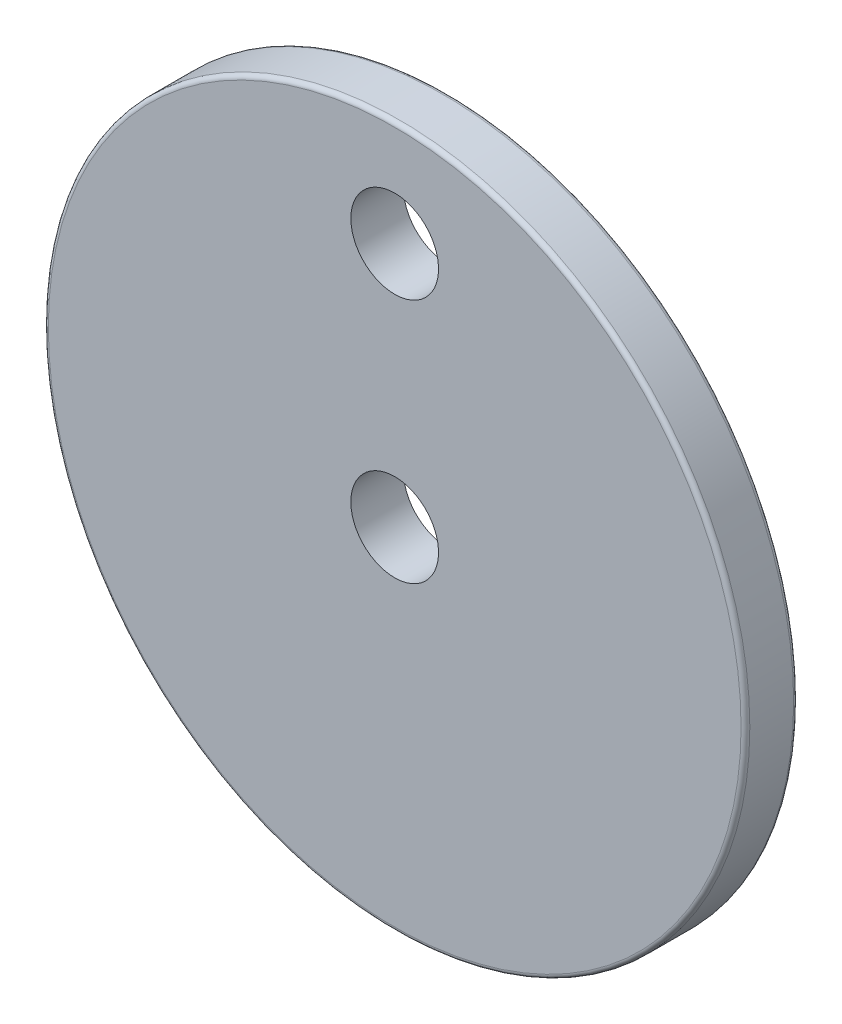
ISO-10303-21;
HEADER;
FILE_DESCRIPTION(('STEP AP214'),'2;1');
FILE_NAME('part.step','',(''),(''),'','','');
FILE_SCHEMA(('AUTOMOTIVE_DESIGN { 1 0 10303 214 1 1 1 1 }'));
ENDSEC;
DATA;
#1=APPLICATION_CONTEXT('core data for automotive mechanical design processes');
#2=APPLICATION_PROTOCOL_DEFINITION('international standard','automotive_design',2000,#1);
#3=PRODUCT_CONTEXT('',#1,'mechanical');
#4=PRODUCT('Part','Part','',(#3));
#5=PRODUCT_RELATED_PRODUCT_CATEGORY('part','',(#4));
#6=PRODUCT_DEFINITION_FORMATION('','',#4);
#7=PRODUCT_DEFINITION_CONTEXT('part definition',#1,'design');
#8=PRODUCT_DEFINITION('design','',#6,#7);
#9=PRODUCT_DEFINITION_SHAPE('','',#8);
#10=(LENGTH_UNIT() NAMED_UNIT(*) SI_UNIT(.MILLI.,.METRE.));
#11=(NAMED_UNIT(*) PLANE_ANGLE_UNIT() SI_UNIT($,.RADIAN.));
#12=(NAMED_UNIT(*) SI_UNIT($,.STERADIAN.) SOLID_ANGLE_UNIT());
#13=UNCERTAINTY_MEASURE_WITH_UNIT(LENGTH_MEASURE(1.E-05),#10,'distance_accuracy_value','');
#14=(GEOMETRIC_REPRESENTATION_CONTEXT(3) GLOBAL_UNCERTAINTY_ASSIGNED_CONTEXT((#13)) GLOBAL_UNIT_ASSIGNED_CONTEXT((#10,
#11,#12)) REPRESENTATION_CONTEXT('',''));
#15=CARTESIAN_POINT('',(0.,0.,0.));
#16=DIRECTION('',(0.,0.,1.));
#17=DIRECTION('',(1.,0.,0.));
#18=AXIS2_PLACEMENT_3D('',#15,#16,#17);
#19=CARTESIAN_POINT('',(0.,0.,38.1));
#20=DIRECTION('',(0.,0.,1.));
#21=DIRECTION('',(1.,0.,0.));
#22=AXIS2_PLACEMENT_3D('',#19,#20,#21);
#23=PLANE('',#22);
#24=CARTESIAN_POINT('',(0.,0.,38.1));
#25=DIRECTION('',(0.,0.,1.));
#26=DIRECTION('',(1.,0.,0.));
#27=AXIS2_PLACEMENT_3D('',#24,#25,#26);
#28=CIRCLE('',#27,501.65);
#29=CARTESIAN_POINT('',(501.65,0.,38.1));
#30=VERTEX_POINT('',#29);
#31=EDGE_CURVE('E10',#30,#30,#28,.T.);
#32=ORIENTED_EDGE('',*,*,#31,.T.);
#33=EDGE_LOOP('',(#32));
#34=FACE_BOUND('',#33,.T.);
#35=CARTESIAN_POINT('',(0.,0.,38.1));
#36=DIRECTION('',(0.,0.,1.));
#37=DIRECTION('',(1.,0.,0.));
#38=AXIS2_PLACEMENT_3D('',#35,#36,#37);
#39=CIRCLE('',#38,63.5);
#40=CARTESIAN_POINT('',(-63.5,0.,38.1));
#41=VERTEX_POINT('',#40);
#42=EDGE_CURVE('E50',#41,#41,#39,.T.);
#43=ORIENTED_EDGE('',*,*,#42,.F.);
#44=EDGE_LOOP('',(#43));
#45=FACE_BOUND('',#44,.T.);
#46=CARTESIAN_POINT('',(0.,355.6,38.1));
#47=DIRECTION('',(0.,0.,1.));
#48=DIRECTION('',(1.,0.,0.));
#49=AXIS2_PLACEMENT_3D('',#46,#47,#48);
#50=CIRCLE('',#49,63.5);
#51=CARTESIAN_POINT('',(-63.5,355.6,38.1));
#52=VERTEX_POINT('',#51);
#53=EDGE_CURVE('E54',#52,#52,#50,.T.);
#54=ORIENTED_EDGE('',*,*,#53,.F.);
#55=EDGE_LOOP('',(#54));
#56=FACE_BOUND('',#55,.T.);
#57=ADVANCED_FACE('F30',(#34,#45,#56),#23,.T.);
#58=CARTESIAN_POINT('',(0.,0.,-38.1));
#59=DIRECTION('',(0.,0.,1.));
#60=DIRECTION('',(1.,0.,0.));
#61=AXIS2_PLACEMENT_3D('',#58,#59,#60);
#62=PLANE('',#61);
#63=CARTESIAN_POINT('',(0.,0.,-38.1));
#64=DIRECTION('',(0.,0.,1.));
#65=DIRECTION('',(1.,0.,0.));
#66=AXIS2_PLACEMENT_3D('',#63,#64,#65);
#67=CIRCLE('',#66,501.65);
#68=CARTESIAN_POINT('',(501.65,0.,-38.1));
#69=VERTEX_POINT('',#68);
#70=EDGE_CURVE('E37',#69,#69,#67,.F.);
#71=ORIENTED_EDGE('',*,*,#70,.T.);
#72=EDGE_LOOP('',(#71));
#73=FACE_BOUND('',#72,.T.);
#74=CARTESIAN_POINT('',(0.,0.,-38.1));
#75=DIRECTION('',(0.,0.,1.));
#76=DIRECTION('',(1.,0.,0.));
#77=AXIS2_PLACEMENT_3D('',#74,#75,#76);
#78=CIRCLE('',#77,63.5);
#79=CARTESIAN_POINT('',(-63.5,0.,-38.1));
#80=VERTEX_POINT('',#79);
#81=EDGE_CURVE('E51',#80,#80,#78,.T.);
#82=ORIENTED_EDGE('',*,*,#81,.T.);
#83=EDGE_LOOP('',(#82));
#84=FACE_BOUND('',#83,.T.);
#85=CARTESIAN_POINT('',(0.,355.6,-38.1));
#86=DIRECTION('',(0.,0.,1.));
#87=DIRECTION('',(1.,0.,0.));
#88=AXIS2_PLACEMENT_3D('',#85,#86,#87);
#89=CIRCLE('',#88,63.5);
#90=CARTESIAN_POINT('',(-63.5,355.6,-38.1));
#91=VERTEX_POINT('',#90);
#92=EDGE_CURVE('E57',#91,#91,#89,.T.);
#93=ORIENTED_EDGE('',*,*,#92,.T.);
#94=EDGE_LOOP('',(#93));
#95=FACE_BOUND('',#94,.T.);
#96=ADVANCED_FACE('F67',(#73,#84,#95),#62,.F.);
#97=CARTESIAN_POINT('',(0.,0.,38.1));
#98=DIRECTION('',(0.,0.,-1.));
#99=DIRECTION('',(-1.,0.,0.));
#100=AXIS2_PLACEMENT_3D('',#97,#98,#99);
#101=CYLINDRICAL_SURFACE('',#100,508.);
#102=CARTESIAN_POINT('',(0.,0.,-31.75));
#103=DIRECTION('',(0.,0.,1.));
#104=DIRECTION('',(1.,0.,0.));
#105=AXIS2_PLACEMENT_3D('',#102,#103,#104);
#106=CIRCLE('',#105,508.);
#107=CARTESIAN_POINT('',(-508.,0.,-31.75));
#108=VERTEX_POINT('',#107);
#109=EDGE_CURVE('E41',#108,#108,#106,.T.);
#110=CARTESIAN_POINT('',(0.,0.,31.75));
#111=DIRECTION('',(0.,0.,1.));
#112=DIRECTION('',(1.,0.,0.));
#113=AXIS2_PLACEMENT_3D('',#110,#111,#112);
#114=CIRCLE('',#113,508.);
#115=CARTESIAN_POINT('',(-508.,0.,31.75));
#116=VERTEX_POINT('',#115);
#117=EDGE_CURVE('E45',#116,#116,#114,.F.);
#118=CARTESIAN_POINT('',(-508.,0.,-31.75));
#119=CARTESIAN_POINT('',(-508.,0.,-31.0885416666667));
#120=CARTESIAN_POINT('',(-508.,0.,-30.4270833333333));
#121=CARTESIAN_POINT('',(-508.,0.,-29.1041666666667));
#122=CARTESIAN_POINT('',(-508.,0.,-28.4427083333333));
#123=CARTESIAN_POINT('',(-508.,0.,-27.1197916666667));
#124=CARTESIAN_POINT('',(-508.,0.,-26.4583333333333));
#125=CARTESIAN_POINT('',(-508.,0.,-25.1354166666667));
#126=CARTESIAN_POINT('',(-508.,0.,-24.4739583333333));
#127=CARTESIAN_POINT('',(-508.,0.,-23.1510416666667));
#128=CARTESIAN_POINT('',(-508.,0.,-22.4895833333333));
#129=CARTESIAN_POINT('',(-508.,0.,-21.1666666666667));
#130=CARTESIAN_POINT('',(-508.,0.,-20.5052083333333));
#131=CARTESIAN_POINT('',(-508.,0.,-19.1822916666667));
#132=CARTESIAN_POINT('',(-508.,0.,-18.5208333333333));
#133=CARTESIAN_POINT('',(-508.,0.,-17.1979166666667));
#134=CARTESIAN_POINT('',(-508.,0.,-16.5364583333333));
#135=CARTESIAN_POINT('',(-508.,0.,-15.2135416666667));
#136=CARTESIAN_POINT('',(-508.,0.,-14.5520833333333));
#137=CARTESIAN_POINT('',(-508.,0.,-13.2291666666667));
#138=CARTESIAN_POINT('',(-508.,0.,-12.5677083333333));
#139=CARTESIAN_POINT('',(-508.,0.,-11.2447916666667));
#140=CARTESIAN_POINT('',(-508.,0.,-10.5833333333333));
#141=CARTESIAN_POINT('',(-508.,0.,-9.26041666666667));
#142=CARTESIAN_POINT('',(-508.,0.,-8.59895833333334));
#143=CARTESIAN_POINT('',(-508.,0.,-7.27604166666667));
#144=CARTESIAN_POINT('',(-508.,0.,-6.61458333333334));
#145=CARTESIAN_POINT('',(-508.,0.,-5.29166666666667));
#146=CARTESIAN_POINT('',(-508.,0.,-4.63020833333334));
#147=CARTESIAN_POINT('',(-508.,0.,-3.30729166666667));
#148=CARTESIAN_POINT('',(-508.,0.,-2.64583333333334));
#149=CARTESIAN_POINT('',(-508.,0.,-1.32291666666668));
#150=CARTESIAN_POINT('',(-508.,0.,-0.661458333333341));
#151=CARTESIAN_POINT('',(-508.,0.,0.661458333333327));
#152=CARTESIAN_POINT('',(-508.,0.,1.32291666666666));
#153=CARTESIAN_POINT('',(-508.,0.,2.64583333333333));
#154=CARTESIAN_POINT('',(-508.,0.,3.30729166666666));
#155=CARTESIAN_POINT('',(-508.,0.,4.63020833333333));
#156=CARTESIAN_POINT('',(-508.,0.,5.29166666666666));
#157=CARTESIAN_POINT('',(-508.,0.,6.61458333333333));
#158=CARTESIAN_POINT('',(-508.,0.,7.27604166666666));
#159=CARTESIAN_POINT('',(-508.,0.,8.59895833333333));
#160=CARTESIAN_POINT('',(-508.,0.,9.26041666666666));
#161=CARTESIAN_POINT('',(-508.,0.,10.5833333333333));
#162=CARTESIAN_POINT('',(-508.,0.,11.2447916666667));
#163=CARTESIAN_POINT('',(-508.,0.,12.5677083333333));
#164=CARTESIAN_POINT('',(-508.,0.,13.2291666666667));
#165=CARTESIAN_POINT('',(-508.,0.,14.5520833333333));
#166=CARTESIAN_POINT('',(-508.,0.,15.2135416666667));
#167=CARTESIAN_POINT('',(-508.,0.,16.5364583333333));
#168=CARTESIAN_POINT('',(-508.,0.,17.1979166666667));
#169=CARTESIAN_POINT('',(-508.,0.,18.5208333333333));
#170=CARTESIAN_POINT('',(-508.,0.,19.1822916666667));
#171=CARTESIAN_POINT('',(-508.,0.,20.5052083333333));
#172=CARTESIAN_POINT('',(-508.,0.,21.1666666666667));
#173=CARTESIAN_POINT('',(-508.,0.,22.4895833333333));
#174=CARTESIAN_POINT('',(-508.,0.,23.1510416666667));
#175=CARTESIAN_POINT('',(-508.,0.,24.4739583333333));
#176=CARTESIAN_POINT('',(-508.,0.,25.1354166666667));
#177=CARTESIAN_POINT('',(-508.,0.,26.4583333333333));
#178=CARTESIAN_POINT('',(-508.,0.,27.1197916666667));
#179=CARTESIAN_POINT('',(-508.,0.,28.4427083333333));
#180=CARTESIAN_POINT('',(-508.,0.,29.1041666666667));
#181=CARTESIAN_POINT('',(-508.,0.,30.4270833333333));
#182=CARTESIAN_POINT('',(-508.,0.,31.0885416666667));
#183=CARTESIAN_POINT('',(-508.,0.,31.75));
#184=B_SPLINE_CURVE_WITH_KNOTS('',3,(#118,#119,#120,#121,#122,#123,#124,#125,#126,#127,#128,
#129,#130,#131,#132,#133,#134,#135,#136,#137,#138,#139,#140,#141,#142,#143,#144,#145,#146,#147,
#148,#149,#150,#151,#152,#153,#154,#155,#156,#157,#158,#159,#160,#161,#162,#163,#164,#165,#166,
#167,#168,#169,#170,#171,#172,#173,#174,#175,#176,#177,#178,#179,#180,#181,#182,#183),
.UNSPECIFIED.,.F.,.F.,(4,2,2,2,2,2,2,2,2,2,2,2,2,2,2,2,2,2,2,2,2,2,2,2,2,2,2,2,2,2,2,2,4),(0.,
1.984375,3.96875000000001,5.953125,7.93749999999999,9.921875,11.90625,13.890625,15.875,
17.859375,19.84375,21.828125,23.8125,25.796875,27.78125,29.765625,31.75,33.734375,35.71875,
37.703125,39.6875,41.671875,43.65625,45.640625,47.625,49.609375,51.59375,53.578125,55.5625,
57.546875,59.53125,61.515625,63.5),.UNSPECIFIED.);
#185=EDGE_CURVE('BSEAM72',#108,#116,#184,.T.);
#186=ORIENTED_EDGE('',*,*,#109,.T.);
#187=ORIENTED_EDGE('',*,*,#117,.T.);
#188=ORIENTED_EDGE('',*,*,#185,.T.);
#189=ORIENTED_EDGE('',*,*,#185,.F.);
#190=EDGE_LOOP('',(#186,#188,#187,#189));
#191=FACE_BOUND('',#190,.T.);
#192=ADVANCED_FACE('F72',(#191),#101,.T.);
#193=CARTESIAN_POINT('',(0.,0.,38.1));
#194=DIRECTION('',(0.,0.,-1.));
#195=DIRECTION('',(-1.,0.,0.));
#196=AXIS2_PLACEMENT_3D('',#193,#194,#195);
#197=CYLINDRICAL_SURFACE('',#196,63.5);
#198=CARTESIAN_POINT('',(-63.5,0.,38.1));
#199=CARTESIAN_POINT('',(-63.5,0.,37.30625));
#200=CARTESIAN_POINT('',(-63.5,0.,36.5125));
#201=CARTESIAN_POINT('',(-63.5,0.,34.925));
#202=CARTESIAN_POINT('',(-63.5,0.,34.13125));
#203=CARTESIAN_POINT('',(-63.5,0.,32.54375));
#204=CARTESIAN_POINT('',(-63.5,0.,31.75));
#205=CARTESIAN_POINT('',(-63.5,0.,30.1625));
#206=CARTESIAN_POINT('',(-63.5,0.,29.36875));
#207=CARTESIAN_POINT('',(-63.5,0.,27.78125));
#208=CARTESIAN_POINT('',(-63.5,0.,26.9875));
#209=CARTESIAN_POINT('',(-63.5,0.,25.4));
#210=CARTESIAN_POINT('',(-63.5,0.,24.60625));
#211=CARTESIAN_POINT('',(-63.5,0.,23.01875));
#212=CARTESIAN_POINT('',(-63.5,0.,22.225));
#213=CARTESIAN_POINT('',(-63.5,0.,20.6375));
#214=CARTESIAN_POINT('',(-63.5,0.,19.84375));
#215=CARTESIAN_POINT('',(-63.5,0.,18.25625));
#216=CARTESIAN_POINT('',(-63.5,0.,17.4625));
#217=CARTESIAN_POINT('',(-63.5,0.,15.875));
#218=CARTESIAN_POINT('',(-63.5,0.,15.08125));
#219=CARTESIAN_POINT('',(-63.5,0.,13.49375));
#220=CARTESIAN_POINT('',(-63.5,0.,12.7));
#221=CARTESIAN_POINT('',(-63.5,0.,11.1125));
#222=CARTESIAN_POINT('',(-63.5,0.,10.31875));
#223=CARTESIAN_POINT('',(-63.5,0.,8.73124999999999));
#224=CARTESIAN_POINT('',(-63.5,0.,7.93749999999999));
#225=CARTESIAN_POINT('',(-63.5,0.,6.35));
#226=CARTESIAN_POINT('',(-63.5,0.,5.55625));
#227=CARTESIAN_POINT('',(-63.5,0.,3.96875));
#228=CARTESIAN_POINT('',(-63.5,0.,3.175));
#229=CARTESIAN_POINT('',(-63.5,0.,1.5875));
#230=CARTESIAN_POINT('',(-63.5,0.,0.793750000000001));
#231=CARTESIAN_POINT('',(-63.5,0.,-0.793750000000001));
#232=CARTESIAN_POINT('',(-63.5,0.,-1.5875));
#233=CARTESIAN_POINT('',(-63.5,0.,-3.175));
#234=CARTESIAN_POINT('',(-63.5,0.,-3.96875));
#235=CARTESIAN_POINT('',(-63.5,0.,-5.55625));
#236=CARTESIAN_POINT('',(-63.5,0.,-6.35));
#237=CARTESIAN_POINT('',(-63.5,0.,-7.93750000000001));
#238=CARTESIAN_POINT('',(-63.5,0.,-8.73125));
#239=CARTESIAN_POINT('',(-63.5,0.,-10.31875));
#240=CARTESIAN_POINT('',(-63.5,0.,-11.1125));
#241=CARTESIAN_POINT('',(-63.5,0.,-12.7));
#242=CARTESIAN_POINT('',(-63.5,0.,-13.49375));
#243=CARTESIAN_POINT('',(-63.5,0.,-15.08125));
#244=CARTESIAN_POINT('',(-63.5,0.,-15.875));
#245=CARTESIAN_POINT('',(-63.5,0.,-17.4625));
#246=CARTESIAN_POINT('',(-63.5,0.,-18.25625));
#247=CARTESIAN_POINT('',(-63.5,0.,-19.84375));
#248=CARTESIAN_POINT('',(-63.5,0.,-20.6375));
#249=CARTESIAN_POINT('',(-63.5,0.,-22.225));
#250=CARTESIAN_POINT('',(-63.5,0.,-23.01875));
#251=CARTESIAN_POINT('',(-63.5,0.,-24.60625));
#252=CARTESIAN_POINT('',(-63.5,0.,-25.4));
#253=CARTESIAN_POINT('',(-63.5,0.,-26.9875));
#254=CARTESIAN_POINT('',(-63.5,0.,-27.78125));
#255=CARTESIAN_POINT('',(-63.5,0.,-29.36875));
#256=CARTESIAN_POINT('',(-63.5,0.,-30.1625));
#257=CARTESIAN_POINT('',(-63.5,0.,-31.75));
#258=CARTESIAN_POINT('',(-63.5,0.,-32.54375));
#259=CARTESIAN_POINT('',(-63.5,0.,-34.13125));
#260=CARTESIAN_POINT('',(-63.5,0.,-34.925));
#261=CARTESIAN_POINT('',(-63.5,0.,-36.5125));
#262=CARTESIAN_POINT('',(-63.5,0.,-37.30625));
#263=CARTESIAN_POINT('',(-63.5,0.,-38.1));
#264=B_SPLINE_CURVE_WITH_KNOTS('',3,(#198,#199,#200,#201,#202,#203,#204,#205,#206,#207,#208,
#209,#210,#211,#212,#213,#214,#215,#216,#217,#218,#219,#220,#221,#222,#223,#224,#225,#226,#227,
#228,#229,#230,#231,#232,#233,#234,#235,#236,#237,#238,#239,#240,#241,#242,#243,#244,#245,#246,
#247,#248,#249,#250,#251,#252,#253,#254,#255,#256,#257,#258,#259,#260,#261,#262,#263),
.UNSPECIFIED.,.F.,.F.,(4,2,2,2,2,2,2,2,2,2,2,2,2,2,2,2,2,2,2,2,2,2,2,2,2,2,2,2,2,2,2,2,4),(0.,
2.38125,4.7625,7.14375,9.52500000000001,11.90625,14.2875,16.66875,19.05,21.43125,23.8125,
26.19375,28.575,30.95625,33.3375,35.71875,38.1,40.48125,42.8625,45.24375,47.625,50.00625,
52.3875,54.76875,57.15,59.53125,61.9125,64.29375,66.675,69.05625,71.4375,73.81875,76.2),.UNSPECIFIED.);
#265=EDGE_CURVE('BSEAM76',#41,#80,#264,.T.);
#266=ORIENTED_EDGE('',*,*,#42,.T.);
#267=ORIENTED_EDGE('',*,*,#81,.F.);
#268=ORIENTED_EDGE('',*,*,#265,.T.);
#269=ORIENTED_EDGE('',*,*,#265,.F.);
#270=EDGE_LOOP('',(#266,#268,#267,#269));
#271=FACE_BOUND('',#270,.T.);
#272=ADVANCED_FACE('F76',(#271),#197,.F.);
#273=CARTESIAN_POINT('',(0.,355.6,38.1));
#274=DIRECTION('',(0.,0.,-1.));
#275=DIRECTION('',(-1.,0.,0.));
#276=AXIS2_PLACEMENT_3D('',#273,#274,#275);
#277=CYLINDRICAL_SURFACE('',#276,63.5);
#278=CARTESIAN_POINT('',(-63.5,355.6,38.1));
#279=CARTESIAN_POINT('',(-63.5,355.6,37.30625));
#280=CARTESIAN_POINT('',(-63.5,355.6,36.5125));
#281=CARTESIAN_POINT('',(-63.5,355.6,34.925));
#282=CARTESIAN_POINT('',(-63.5,355.6,34.13125));
#283=CARTESIAN_POINT('',(-63.5,355.6,32.54375));
#284=CARTESIAN_POINT('',(-63.5,355.6,31.75));
#285=CARTESIAN_POINT('',(-63.5,355.6,30.1625));
#286=CARTESIAN_POINT('',(-63.5,355.6,29.36875));
#287=CARTESIAN_POINT('',(-63.5,355.6,27.78125));
#288=CARTESIAN_POINT('',(-63.5,355.6,26.9875));
#289=CARTESIAN_POINT('',(-63.5,355.6,25.4));
#290=CARTESIAN_POINT('',(-63.5,355.6,24.60625));
#291=CARTESIAN_POINT('',(-63.5,355.6,23.01875));
#292=CARTESIAN_POINT('',(-63.5,355.6,22.225));
#293=CARTESIAN_POINT('',(-63.5,355.6,20.6375));
#294=CARTESIAN_POINT('',(-63.5,355.6,19.84375));
#295=CARTESIAN_POINT('',(-63.5,355.6,18.25625));
#296=CARTESIAN_POINT('',(-63.5,355.6,17.4625));
#297=CARTESIAN_POINT('',(-63.5,355.6,15.875));
#298=CARTESIAN_POINT('',(-63.5,355.6,15.08125));
#299=CARTESIAN_POINT('',(-63.5,355.6,13.49375));
#300=CARTESIAN_POINT('',(-63.5,355.6,12.7));
#301=CARTESIAN_POINT('',(-63.5,355.6,11.1125));
#302=CARTESIAN_POINT('',(-63.5,355.6,10.31875));
#303=CARTESIAN_POINT('',(-63.5,355.6,8.73124999999999));
#304=CARTESIAN_POINT('',(-63.5,355.6,7.93749999999999));
#305=CARTESIAN_POINT('',(-63.5,355.6,6.35));
#306=CARTESIAN_POINT('',(-63.5,355.6,5.55625));
#307=CARTESIAN_POINT('',(-63.5,355.6,3.96875));
#308=CARTESIAN_POINT('',(-63.5,355.6,3.175));
#309=CARTESIAN_POINT('',(-63.5,355.6,1.5875));
#310=CARTESIAN_POINT('',(-63.5,355.6,0.793750000000001));
#311=CARTESIAN_POINT('',(-63.5,355.6,-0.793750000000001));
#312=CARTESIAN_POINT('',(-63.5,355.6,-1.5875));
#313=CARTESIAN_POINT('',(-63.5,355.6,-3.175));
#314=CARTESIAN_POINT('',(-63.5,355.6,-3.96875));
#315=CARTESIAN_POINT('',(-63.5,355.6,-5.55625));
#316=CARTESIAN_POINT('',(-63.5,355.6,-6.35));
#317=CARTESIAN_POINT('',(-63.5,355.6,-7.93750000000001));
#318=CARTESIAN_POINT('',(-63.5,355.6,-8.73125));
#319=CARTESIAN_POINT('',(-63.5,355.6,-10.31875));
#320=CARTESIAN_POINT('',(-63.5,355.6,-11.1125));
#321=CARTESIAN_POINT('',(-63.5,355.6,-12.7));
#322=CARTESIAN_POINT('',(-63.5,355.6,-13.49375));
#323=CARTESIAN_POINT('',(-63.5,355.6,-15.08125));
#324=CARTESIAN_POINT('',(-63.5,355.6,-15.875));
#325=CARTESIAN_POINT('',(-63.5,355.6,-17.4625));
#326=CARTESIAN_POINT('',(-63.5,355.6,-18.25625));
#327=CARTESIAN_POINT('',(-63.5,355.6,-19.84375));
#328=CARTESIAN_POINT('',(-63.5,355.6,-20.6375));
#329=CARTESIAN_POINT('',(-63.5,355.6,-22.225));
#330=CARTESIAN_POINT('',(-63.5,355.6,-23.01875));
#331=CARTESIAN_POINT('',(-63.5,355.6,-24.60625));
#332=CARTESIAN_POINT('',(-63.5,355.6,-25.4));
#333=CARTESIAN_POINT('',(-63.5,355.6,-26.9875));
#334=CARTESIAN_POINT('',(-63.5,355.6,-27.78125));
#335=CARTESIAN_POINT('',(-63.5,355.6,-29.36875));
#336=CARTESIAN_POINT('',(-63.5,355.6,-30.1625));
#337=CARTESIAN_POINT('',(-63.5,355.6,-31.75));
#338=CARTESIAN_POINT('',(-63.5,355.6,-32.54375));
#339=CARTESIAN_POINT('',(-63.5,355.6,-34.13125));
#340=CARTESIAN_POINT('',(-63.5,355.6,-34.925));
#341=CARTESIAN_POINT('',(-63.5,355.6,-36.5125));
#342=CARTESIAN_POINT('',(-63.5,355.6,-37.30625));
#343=CARTESIAN_POINT('',(-63.5,355.6,-38.1));
#344=B_SPLINE_CURVE_WITH_KNOTS('',3,(#278,#279,#280,#281,#282,#283,#284,#285,#286,#287,#288,
#289,#290,#291,#292,#293,#294,#295,#296,#297,#298,#299,#300,#301,#302,#303,#304,#305,#306,#307,
#308,#309,#310,#311,#312,#313,#314,#315,#316,#317,#318,#319,#320,#321,#322,#323,#324,#325,#326,
#327,#328,#329,#330,#331,#332,#333,#334,#335,#336,#337,#338,#339,#340,#341,#342,#343),
.UNSPECIFIED.,.F.,.F.,(4,2,2,2,2,2,2,2,2,2,2,2,2,2,2,2,2,2,2,2,2,2,2,2,2,2,2,2,2,2,2,2,4),(0.,
2.38125,4.7625,7.14375,9.52500000000001,11.90625,14.2875,16.66875,19.05,21.43125,23.8125,
26.19375,28.575,30.95625,33.3375,35.71875,38.1,40.48125,42.8625,45.24375,47.625,50.00625,
52.3875,54.76875,57.15,59.53125,61.9125,64.29375,66.675,69.05625,71.4375,73.81875,76.2),.UNSPECIFIED.);
#345=EDGE_CURVE('BSEAM63',#52,#91,#344,.T.);
#346=ORIENTED_EDGE('',*,*,#53,.T.);
#347=ORIENTED_EDGE('',*,*,#92,.F.);
#348=ORIENTED_EDGE('',*,*,#345,.T.);
#349=ORIENTED_EDGE('',*,*,#345,.F.);
#350=EDGE_LOOP('',(#346,#348,#347,#349));
#351=FACE_BOUND('',#350,.T.);
#352=ADVANCED_FACE('F63',(#351),#277,.F.);
#353=CARTESIAN_POINT('',(0.,0.,-31.75));
#354=DIRECTION('',(0.,0.,1.));
#355=DIRECTION('',(1.,0.,0.));
#356=AXIS2_PLACEMENT_3D('',#353,#354,#355);
#357=TOROIDAL_SURFACE('',#356,501.65,6.35);
#358=ORIENTED_EDGE('',*,*,#70,.F.);
#359=EDGE_LOOP('',(#358));
#360=FACE_BOUND('',#359,.T.);
#361=ORIENTED_EDGE('',*,*,#109,.F.);
#362=EDGE_LOOP('',(#361));
#363=FACE_BOUND('',#362,.T.);
#364=ADVANCED_FACE('F81',(#360,#363),#357,.T.);
#365=CARTESIAN_POINT('',(0.,0.,31.75));
#366=DIRECTION('',(0.,0.,1.));
#367=DIRECTION('',(1.,0.,0.));
#368=AXIS2_PLACEMENT_3D('',#365,#366,#367);
#369=TOROIDAL_SURFACE('',#368,501.65,6.35);
#370=ORIENTED_EDGE('',*,*,#117,.F.);
#371=EDGE_LOOP('',(#370));
#372=FACE_BOUND('',#371,.T.);
#373=ORIENTED_EDGE('',*,*,#31,.F.);
#374=EDGE_LOOP('',(#373));
#375=FACE_BOUND('',#374,.T.);
#376=ADVANCED_FACE('F32',(#372,#375),#369,.T.);
#377=CLOSED_SHELL('',(#57,#96,#192,#272,#352,#364,#376));
#378=MANIFOLD_SOLID_BREP('B2',#377);
#379=ADVANCED_BREP_SHAPE_REPRESENTATION('',(#18,#378),#14);
#380=SHAPE_DEFINITION_REPRESENTATION(#9,#379);
ENDSEC;
END-ISO-10303-21;
